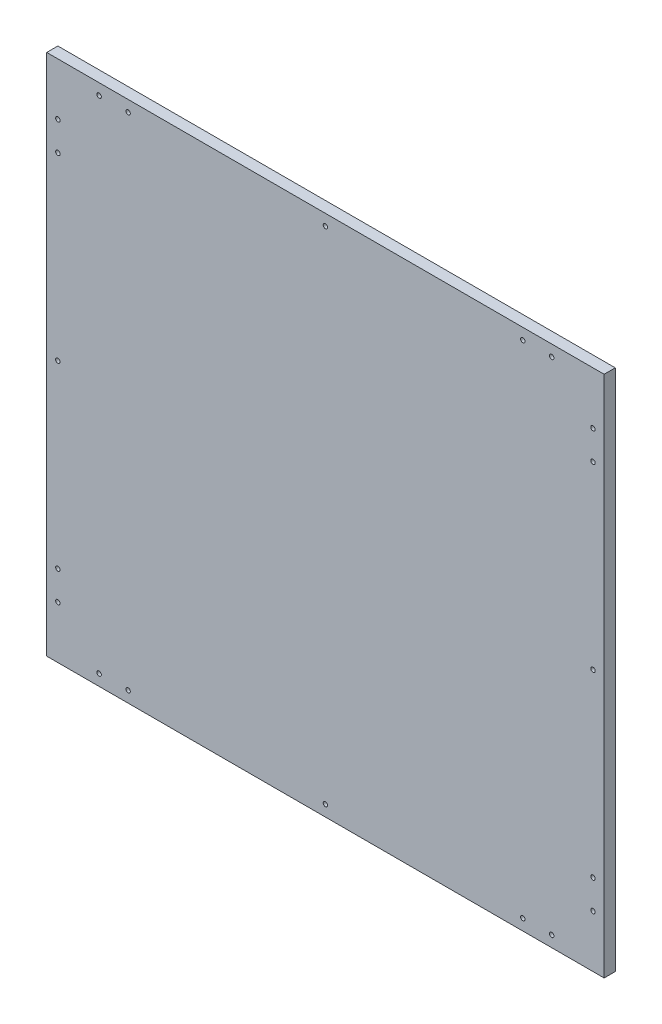
ISO-10303-21;
HEADER;
FILE_DESCRIPTION(('STEP AP214'),'2;1');
FILE_NAME('part.step','',(''),(''),'','','');
FILE_SCHEMA(('AUTOMOTIVE_DESIGN { 1 0 10303 214 1 1 1 1 }'));
ENDSEC;
DATA;
#1=APPLICATION_CONTEXT('core data for automotive mechanical design processes');
#2=APPLICATION_PROTOCOL_DEFINITION('international standard','automotive_design',2000,#1);
#3=PRODUCT_CONTEXT('',#1,'mechanical');
#4=PRODUCT('Part','Part','',(#3));
#5=PRODUCT_RELATED_PRODUCT_CATEGORY('part','',(#4));
#6=PRODUCT_DEFINITION_FORMATION('','',#4);
#7=PRODUCT_DEFINITION_CONTEXT('part definition',#1,'design');
#8=PRODUCT_DEFINITION('design','',#6,#7);
#9=PRODUCT_DEFINITION_SHAPE('','',#8);
#10=(LENGTH_UNIT() NAMED_UNIT(*) SI_UNIT(.MILLI.,.METRE.));
#11=(NAMED_UNIT(*) PLANE_ANGLE_UNIT() SI_UNIT($,.RADIAN.));
#12=(NAMED_UNIT(*) SI_UNIT($,.STERADIAN.) SOLID_ANGLE_UNIT());
#13=UNCERTAINTY_MEASURE_WITH_UNIT(LENGTH_MEASURE(1.E-05),#10,'distance_accuracy_value','');
#14=(GEOMETRIC_REPRESENTATION_CONTEXT(3) GLOBAL_UNCERTAINTY_ASSIGNED_CONTEXT((#13)) GLOBAL_UNIT_ASSIGNED_CONTEXT((#10,
#11,#12)) REPRESENTATION_CONTEXT('',''));
#15=CARTESIAN_POINT('',(0.,0.,0.));
#16=DIRECTION('',(0.,0.,1.));
#17=DIRECTION('',(1.,0.,0.));
#18=AXIS2_PLACEMENT_3D('',#15,#16,#17);
#19=CARTESIAN_POINT('',(0.,0.,10.));
#20=DIRECTION('',(0.,0.,1.));
#21=DIRECTION('',(1.,0.,0.));
#22=AXIS2_PLACEMENT_3D('',#19,#20,#21);
#23=PLANE('',#22);
#24=CARTESIAN_POINT('',(-177.,-224.5,10.));
#25=DIRECTION('',(0.,0.,-1.));
#26=DIRECTION('',(-1.,0.,0.));
#27=AXIS2_PLACEMENT_3D('',#24,#25,#26);
#28=CIRCLE('',#27,2.);
#29=CARTESIAN_POINT('',(-179.,-224.5,10.));
#30=VERTEX_POINT('',#29);
#31=EDGE_CURVE('E152',#30,#30,#28,.T.);
#32=ORIENTED_EDGE('',*,*,#31,.T.);
#33=EDGE_LOOP('',(#32));
#34=FACE_BOUND('',#33,.T.);
#35=CARTESIAN_POINT('',(0.,224.5,10.));
#36=DIRECTION('',(0.,0.,-1.));
#37=DIRECTION('',(-1.,0.,0.));
#38=AXIS2_PLACEMENT_3D('',#35,#36,#37);
#39=CIRCLE('',#38,2.);
#40=CARTESIAN_POINT('',(-1.99999999999994,224.5,10.));
#41=VERTEX_POINT('',#40);
#42=EDGE_CURVE('E98',#41,#41,#39,.T.);
#43=ORIENTED_EDGE('',*,*,#42,.T.);
#44=EDGE_LOOP('',(#43));
#45=FACE_BOUND('',#44,.T.);
#46=CARTESIAN_POINT('',(177.,224.5,10.));
#47=DIRECTION('',(0.,0.,-1.));
#48=DIRECTION('',(-1.,0.,0.));
#49=AXIS2_PLACEMENT_3D('',#46,#47,#48);
#50=CIRCLE('',#49,2.);
#51=CARTESIAN_POINT('',(175.,224.5,10.));
#52=VERTEX_POINT('',#51);
#53=EDGE_CURVE('E117',#52,#52,#50,.T.);
#54=ORIENTED_EDGE('',*,*,#53,.T.);
#55=EDGE_LOOP('',(#54));
#56=FACE_BOUND('',#55,.T.);
#57=CARTESIAN_POINT('',(203.,224.5,10.));
#58=DIRECTION('',(0.,0.,-1.));
#59=DIRECTION('',(-1.,0.,0.));
#60=AXIS2_PLACEMENT_3D('',#57,#58,#59);
#61=CIRCLE('',#60,2.);
#62=CARTESIAN_POINT('',(201.,224.5,10.));
#63=VERTEX_POINT('',#62);
#64=EDGE_CURVE('E111',#63,#63,#61,.T.);
#65=ORIENTED_EDGE('',*,*,#64,.T.);
#66=EDGE_LOOP('',(#65));
#67=FACE_BOUND('',#66,.T.);
#68=CARTESIAN_POINT('',(240.,187.5,10.));
#69=DIRECTION('',(0.,0.,-1.));
#70=DIRECTION('',(-1.,0.,0.));
#71=AXIS2_PLACEMENT_3D('',#68,#69,#70);
#72=CIRCLE('',#71,2.);
#73=CARTESIAN_POINT('',(238.,187.5,10.));
#74=VERTEX_POINT('',#73);
#75=EDGE_CURVE('E104',#74,#74,#72,.T.);
#76=ORIENTED_EDGE('',*,*,#75,.T.);
#77=EDGE_LOOP('',(#76));
#78=FACE_BOUND('',#77,.T.);
#79=CARTESIAN_POINT('',(240.,161.5,10.));
#80=DIRECTION('',(0.,0.,-1.));
#81=DIRECTION('',(-1.,0.,0.));
#82=AXIS2_PLACEMENT_3D('',#79,#80,#81);
#83=CIRCLE('',#82,2.);
#84=CARTESIAN_POINT('',(238.,161.5,10.));
#85=VERTEX_POINT('',#84);
#86=EDGE_CURVE('E105',#85,#85,#83,.T.);
#87=ORIENTED_EDGE('',*,*,#86,.T.);
#88=EDGE_LOOP('',(#87));
#89=FACE_BOUND('',#88,.T.);
#90=CARTESIAN_POINT('',(-203.,-224.5,10.));
#91=DIRECTION('',(0.,0.,-1.));
#92=DIRECTION('',(-1.,0.,0.));
#93=AXIS2_PLACEMENT_3D('',#90,#91,#92);
#94=CIRCLE('',#93,2.);
#95=CARTESIAN_POINT('',(-205.,-224.5,10.));
#96=VERTEX_POINT('',#95);
#97=EDGE_CURVE('E153',#96,#96,#94,.T.);
#98=ORIENTED_EDGE('',*,*,#97,.T.);
#99=EDGE_LOOP('',(#98));
#100=FACE_BOUND('',#99,.T.);
#101=CARTESIAN_POINT('',(-240.,-187.5,10.));
#102=DIRECTION('',(0.,0.,-1.));
#103=DIRECTION('',(-1.,0.,0.));
#104=AXIS2_PLACEMENT_3D('',#101,#102,#103);
#105=CIRCLE('',#104,2.);
#106=CARTESIAN_POINT('',(-242.,-187.5,10.));
#107=VERTEX_POINT('',#106);
#108=EDGE_CURVE('E206',#107,#107,#105,.T.);
#109=ORIENTED_EDGE('',*,*,#108,.T.);
#110=EDGE_LOOP('',(#109));
#111=FACE_BOUND('',#110,.T.);
#112=CARTESIAN_POINT('',(-240.,-161.5,10.));
#113=DIRECTION('',(0.,0.,-1.));
#114=DIRECTION('',(-1.,0.,0.));
#115=AXIS2_PLACEMENT_3D('',#112,#113,#114);
#116=CIRCLE('',#115,2.);
#117=CARTESIAN_POINT('',(-242.,-161.5,10.));
#118=VERTEX_POINT('',#117);
#119=EDGE_CURVE('E200',#118,#118,#116,.T.);
#120=ORIENTED_EDGE('',*,*,#119,.T.);
#121=EDGE_LOOP('',(#120));
#122=FACE_BOUND('',#121,.T.);
#123=CARTESIAN_POINT('',(240.,1.18687539380863E-13,10.));
#124=DIRECTION('',(0.,0.,-1.));
#125=DIRECTION('',(-1.,0.,0.));
#126=AXIS2_PLACEMENT_3D('',#123,#124,#125);
#127=CIRCLE('',#126,2.);
#128=CARTESIAN_POINT('',(238.,1.18687539380863E-13,10.));
#129=VERTEX_POINT('',#128);
#130=EDGE_CURVE('E95',#129,#129,#127,.T.);
#131=ORIENTED_EDGE('',*,*,#130,.T.);
#132=EDGE_LOOP('',(#131));
#133=FACE_BOUND('',#132,.T.);
#134=DIRECTION('',(0.,1.,0.));
#135=VECTOR('',#134,1.);
#136=CARTESIAN_POINT('',(250.,234.5,10.));
#137=LINE('',#136,#135);
#138=CARTESIAN_POINT('',(250.,-234.5,10.));
#139=VERTEX_POINT('',#138);
#140=CARTESIAN_POINT('',(250.,234.5,10.));
#141=VERTEX_POINT('',#140);
#142=EDGE_CURVE('E68',#139,#141,#137,.T.);
#143=ORIENTED_EDGE('',*,*,#142,.T.);
#144=DIRECTION('',(-1.,0.,0.));
#145=VECTOR('',#144,1.);
#146=CARTESIAN_POINT('',(-250.,234.5,10.));
#147=LINE('',#146,#145);
#148=CARTESIAN_POINT('',(-250.,234.5,10.));
#149=VERTEX_POINT('',#148);
#150=EDGE_CURVE('E63',#141,#149,#147,.T.);
#151=ORIENTED_EDGE('',*,*,#150,.T.);
#152=DIRECTION('',(0.,-1.,0.));
#153=VECTOR('',#152,1.);
#154=CARTESIAN_POINT('',(-250.,234.5,10.));
#155=LINE('',#154,#153);
#156=CARTESIAN_POINT('',(-250.,-234.5,10.));
#157=VERTEX_POINT('',#156);
#158=EDGE_CURVE('E66',#149,#157,#155,.T.);
#159=ORIENTED_EDGE('',*,*,#158,.T.);
#160=DIRECTION('',(1.,0.,0.));
#161=VECTOR('',#160,1.);
#162=CARTESIAN_POINT('',(-250.,-234.5,10.));
#163=LINE('',#162,#161);
#164=EDGE_CURVE('E33',#157,#139,#163,.T.);
#165=ORIENTED_EDGE('',*,*,#164,.T.);
#166=EDGE_LOOP('',(#143,#151,#159,#165));
#167=FACE_BOUND('',#166,.T.);
#168=CARTESIAN_POINT('',(-240.,187.5,10.));
#169=DIRECTION('',(0.,0.,1.));
#170=DIRECTION('',(1.,0.,0.));
#171=AXIS2_PLACEMENT_3D('',#168,#169,#170);
#172=CIRCLE('',#171,2.);
#173=CARTESIAN_POINT('',(-238.,187.5,10.));
#174=VERTEX_POINT('',#173);
#175=EDGE_CURVE('E128',#174,#174,#172,.T.);
#176=ORIENTED_EDGE('',*,*,#175,.F.);
#177=EDGE_LOOP('',(#176));
#178=FACE_BOUND('',#177,.T.);
#179=CARTESIAN_POINT('',(-203.,224.5,10.));
#180=DIRECTION('',(0.,0.,1.));
#181=DIRECTION('',(1.,0.,0.));
#182=AXIS2_PLACEMENT_3D('',#179,#180,#181);
#183=CIRCLE('',#182,2.);
#184=CARTESIAN_POINT('',(-201.,224.5,10.));
#185=VERTEX_POINT('',#184);
#186=EDGE_CURVE('E135',#185,#185,#183,.T.);
#187=ORIENTED_EDGE('',*,*,#186,.F.);
#188=EDGE_LOOP('',(#187));
#189=FACE_BOUND('',#188,.T.);
#190=CARTESIAN_POINT('',(-177.,224.5,10.));
#191=DIRECTION('',(0.,0.,1.));
#192=DIRECTION('',(1.,0.,0.));
#193=AXIS2_PLACEMENT_3D('',#190,#191,#192);
#194=CIRCLE('',#193,2.);
#195=CARTESIAN_POINT('',(-175.,224.5,10.));
#196=VERTEX_POINT('',#195);
#197=EDGE_CURVE('E141',#196,#196,#194,.T.);
#198=ORIENTED_EDGE('',*,*,#197,.F.);
#199=EDGE_LOOP('',(#198));
#200=FACE_BOUND('',#199,.T.);
#201=CARTESIAN_POINT('',(-240.,161.5,10.));
#202=DIRECTION('',(0.,0.,1.));
#203=DIRECTION('',(1.,0.,0.));
#204=AXIS2_PLACEMENT_3D('',#201,#202,#203);
#205=CIRCLE('',#204,2.);
#206=CARTESIAN_POINT('',(-238.,161.5,10.));
#207=VERTEX_POINT('',#206);
#208=EDGE_CURVE('E129',#207,#207,#205,.T.);
#209=ORIENTED_EDGE('',*,*,#208,.F.);
#210=EDGE_LOOP('',(#209));
#211=FACE_BOUND('',#210,.T.);
#212=CARTESIAN_POINT('',(-240.,0.,10.));
#213=DIRECTION('',(0.,0.,1.));
#214=DIRECTION('',(1.,0.,0.));
#215=AXIS2_PLACEMENT_3D('',#212,#213,#214);
#216=CIRCLE('',#215,2.);
#217=CARTESIAN_POINT('',(-238.,0.,10.));
#218=VERTEX_POINT('',#217);
#219=EDGE_CURVE('E189',#218,#218,#216,.T.);
#220=ORIENTED_EDGE('',*,*,#219,.F.);
#221=EDGE_LOOP('',(#220));
#222=FACE_BOUND('',#221,.T.);
#223=CARTESIAN_POINT('',(240.,-161.5,10.));
#224=DIRECTION('',(0.,0.,1.));
#225=DIRECTION('',(1.,0.,0.));
#226=AXIS2_PLACEMENT_3D('',#223,#224,#225);
#227=CIRCLE('',#226,2.);
#228=CARTESIAN_POINT('',(242.,-161.5,10.));
#229=VERTEX_POINT('',#228);
#230=EDGE_CURVE('E183',#229,#229,#227,.T.);
#231=ORIENTED_EDGE('',*,*,#230,.F.);
#232=EDGE_LOOP('',(#231));
#233=FACE_BOUND('',#232,.T.);
#234=CARTESIAN_POINT('',(240.,-187.5,10.));
#235=DIRECTION('',(0.,0.,1.));
#236=DIRECTION('',(1.,0.,0.));
#237=AXIS2_PLACEMENT_3D('',#234,#235,#236);
#238=CIRCLE('',#237,2.);
#239=CARTESIAN_POINT('',(242.,-187.5,10.));
#240=VERTEX_POINT('',#239);
#241=EDGE_CURVE('E177',#240,#240,#238,.T.);
#242=ORIENTED_EDGE('',*,*,#241,.F.);
#243=EDGE_LOOP('',(#242));
#244=FACE_BOUND('',#243,.T.);
#245=CARTESIAN_POINT('',(203.,-224.5,10.));
#246=DIRECTION('',(0.,0.,1.));
#247=DIRECTION('',(1.,0.,0.));
#248=AXIS2_PLACEMENT_3D('',#245,#246,#247);
#249=CIRCLE('',#248,2.);
#250=CARTESIAN_POINT('',(205.,-224.5,10.));
#251=VERTEX_POINT('',#250);
#252=EDGE_CURVE('E171',#251,#251,#249,.T.);
#253=ORIENTED_EDGE('',*,*,#252,.F.);
#254=EDGE_LOOP('',(#253));
#255=FACE_BOUND('',#254,.T.);
#256=CARTESIAN_POINT('',(177.,-224.5,10.));
#257=DIRECTION('',(0.,0.,1.));
#258=DIRECTION('',(1.,0.,0.));
#259=AXIS2_PLACEMENT_3D('',#256,#257,#258);
#260=CIRCLE('',#259,2.);
#261=CARTESIAN_POINT('',(179.,-224.5,10.));
#262=VERTEX_POINT('',#261);
#263=EDGE_CURVE('E165',#262,#262,#260,.T.);
#264=ORIENTED_EDGE('',*,*,#263,.F.);
#265=EDGE_LOOP('',(#264));
#266=FACE_BOUND('',#265,.T.);
#267=CARTESIAN_POINT('',(0.,-224.5,10.));
#268=DIRECTION('',(0.,0.,1.));
#269=DIRECTION('',(1.,0.,0.));
#270=AXIS2_PLACEMENT_3D('',#267,#268,#269);
#271=CIRCLE('',#270,2.);
#272=CARTESIAN_POINT('',(2.00000000000006,-224.5,10.));
#273=VERTEX_POINT('',#272);
#274=EDGE_CURVE('E159',#273,#273,#271,.T.);
#275=ORIENTED_EDGE('',*,*,#274,.F.);
#276=EDGE_LOOP('',(#275));
#277=FACE_BOUND('',#276,.T.);
#278=ADVANCED_FACE('F16',(#34,#45,#56,#67,#78,#89,#100,#111,#122,#133,#167,#178,#189,#200,#211,
#222,#233,#244,#255,#266,#277),#23,.T.);
#279=CARTESIAN_POINT('',(0.,0.,0.));
#280=DIRECTION('',(0.,0.,1.));
#281=DIRECTION('',(1.,0.,0.));
#282=AXIS2_PLACEMENT_3D('',#279,#280,#281);
#283=PLANE('',#282);
#284=CARTESIAN_POINT('',(-177.,-224.5,0.));
#285=DIRECTION('',(0.,0.,-1.));
#286=DIRECTION('',(-1.,0.,0.));
#287=AXIS2_PLACEMENT_3D('',#284,#285,#286);
#288=CIRCLE('',#287,2.);
#289=CARTESIAN_POINT('',(-179.,-224.5,0.));
#290=VERTEX_POINT('',#289);
#291=EDGE_CURVE('E149',#290,#290,#288,.T.);
#292=ORIENTED_EDGE('',*,*,#291,.F.);
#293=EDGE_LOOP('',(#292));
#294=FACE_BOUND('',#293,.T.);
#295=CARTESIAN_POINT('',(177.,-224.5,0.));
#296=DIRECTION('',(0.,0.,1.));
#297=DIRECTION('',(1.,0.,0.));
#298=AXIS2_PLACEMENT_3D('',#295,#296,#297);
#299=CIRCLE('',#298,2.);
#300=CARTESIAN_POINT('',(179.,-224.5,0.));
#301=VERTEX_POINT('',#300);
#302=EDGE_CURVE('E162',#301,#301,#299,.T.);
#303=ORIENTED_EDGE('',*,*,#302,.T.);
#304=EDGE_LOOP('',(#303));
#305=FACE_BOUND('',#304,.T.);
#306=CARTESIAN_POINT('',(240.,-187.5,0.));
#307=DIRECTION('',(0.,0.,1.));
#308=DIRECTION('',(1.,0.,0.));
#309=AXIS2_PLACEMENT_3D('',#306,#307,#308);
#310=CIRCLE('',#309,2.);
#311=CARTESIAN_POINT('',(242.,-187.5,0.));
#312=VERTEX_POINT('',#311);
#313=EDGE_CURVE('E174',#312,#312,#310,.T.);
#314=ORIENTED_EDGE('',*,*,#313,.T.);
#315=EDGE_LOOP('',(#314));
#316=FACE_BOUND('',#315,.T.);
#317=CARTESIAN_POINT('',(-240.,0.,0.));
#318=DIRECTION('',(0.,0.,1.));
#319=DIRECTION('',(1.,0.,0.));
#320=AXIS2_PLACEMENT_3D('',#317,#318,#319);
#321=CIRCLE('',#320,2.);
#322=CARTESIAN_POINT('',(-238.,0.,0.));
#323=VERTEX_POINT('',#322);
#324=EDGE_CURVE('E186',#323,#323,#321,.T.);
#325=ORIENTED_EDGE('',*,*,#324,.T.);
#326=EDGE_LOOP('',(#325));
#327=FACE_BOUND('',#326,.T.);
#328=CARTESIAN_POINT('',(-177.,224.5,0.));
#329=DIRECTION('',(0.,0.,1.));
#330=DIRECTION('',(1.,0.,0.));
#331=AXIS2_PLACEMENT_3D('',#328,#329,#330);
#332=CIRCLE('',#331,2.);
#333=CARTESIAN_POINT('',(-175.,224.5,0.));
#334=VERTEX_POINT('',#333);
#335=EDGE_CURVE('E138',#334,#334,#332,.T.);
#336=ORIENTED_EDGE('',*,*,#335,.T.);
#337=EDGE_LOOP('',(#336));
#338=FACE_BOUND('',#337,.T.);
#339=CARTESIAN_POINT('',(-240.,187.5,0.));
#340=DIRECTION('',(0.,0.,1.));
#341=DIRECTION('',(1.,0.,0.));
#342=AXIS2_PLACEMENT_3D('',#339,#340,#341);
#343=CIRCLE('',#342,2.);
#344=CARTESIAN_POINT('',(-238.,187.5,0.));
#345=VERTEX_POINT('',#344);
#346=EDGE_CURVE('E125',#345,#345,#343,.T.);
#347=ORIENTED_EDGE('',*,*,#346,.T.);
#348=EDGE_LOOP('',(#347));
#349=FACE_BOUND('',#348,.T.);
#350=CARTESIAN_POINT('',(-203.,-224.5,0.));
#351=DIRECTION('',(0.,0.,-1.));
#352=DIRECTION('',(-1.,0.,0.));
#353=AXIS2_PLACEMENT_3D('',#350,#351,#352);
#354=CIRCLE('',#353,2.);
#355=CARTESIAN_POINT('',(-205.,-224.5,0.));
#356=VERTEX_POINT('',#355);
#357=EDGE_CURVE('E209',#356,#356,#354,.T.);
#358=ORIENTED_EDGE('',*,*,#357,.F.);
#359=EDGE_LOOP('',(#358));
#360=FACE_BOUND('',#359,.T.);
#361=CARTESIAN_POINT('',(-240.,-187.5,0.));
#362=DIRECTION('',(0.,0.,-1.));
#363=DIRECTION('',(-1.,0.,0.));
#364=AXIS2_PLACEMENT_3D('',#361,#362,#363);
#365=CIRCLE('',#364,2.);
#366=CARTESIAN_POINT('',(-242.,-187.5,0.));
#367=VERTEX_POINT('',#366);
#368=EDGE_CURVE('E203',#367,#367,#365,.T.);
#369=ORIENTED_EDGE('',*,*,#368,.F.);
#370=EDGE_LOOP('',(#369));
#371=FACE_BOUND('',#370,.T.);
#372=CARTESIAN_POINT('',(-240.,-161.5,0.));
#373=DIRECTION('',(0.,0.,-1.));
#374=DIRECTION('',(-1.,0.,0.));
#375=AXIS2_PLACEMENT_3D('',#372,#373,#374);
#376=CIRCLE('',#375,2.);
#377=CARTESIAN_POINT('',(-242.,-161.5,0.));
#378=VERTEX_POINT('',#377);
#379=EDGE_CURVE('E197',#378,#378,#376,.T.);
#380=ORIENTED_EDGE('',*,*,#379,.F.);
#381=EDGE_LOOP('',(#380));
#382=FACE_BOUND('',#381,.T.);
#383=CARTESIAN_POINT('',(240.,1.18687539380863E-13,0.));
#384=DIRECTION('',(0.,0.,-1.));
#385=DIRECTION('',(-1.,0.,0.));
#386=AXIS2_PLACEMENT_3D('',#383,#384,#385);
#387=CIRCLE('',#386,2.);
#388=CARTESIAN_POINT('',(238.,1.18687539380863E-13,0.));
#389=VERTEX_POINT('',#388);
#390=EDGE_CURVE('E83',#389,#389,#387,.T.);
#391=ORIENTED_EDGE('',*,*,#390,.F.);
#392=EDGE_LOOP('',(#391));
#393=FACE_BOUND('',#392,.T.);
#394=DIRECTION('',(0.,1.,0.));
#395=VECTOR('',#394,1.);
#396=CARTESIAN_POINT('',(250.,234.5,0.));
#397=LINE('',#396,#395);
#398=CARTESIAN_POINT('',(250.,-234.5,0.));
#399=VERTEX_POINT('',#398);
#400=CARTESIAN_POINT('',(250.,234.5,0.));
#401=VERTEX_POINT('',#400);
#402=EDGE_CURVE('E80',#399,#401,#397,.T.);
#403=ORIENTED_EDGE('',*,*,#402,.F.);
#404=DIRECTION('',(1.,0.,0.));
#405=VECTOR('',#404,1.);
#406=CARTESIAN_POINT('',(-250.,-234.5,0.));
#407=LINE('',#406,#405);
#408=CARTESIAN_POINT('',(-250.,-234.5,0.));
#409=VERTEX_POINT('',#408);
#410=EDGE_CURVE('E56',#409,#399,#407,.T.);
#411=ORIENTED_EDGE('',*,*,#410,.F.);
#412=DIRECTION('',(0.,-1.,0.));
#413=VECTOR('',#412,1.);
#414=CARTESIAN_POINT('',(-250.,234.5,0.));
#415=LINE('',#414,#413);
#416=CARTESIAN_POINT('',(-250.,234.5,0.));
#417=VERTEX_POINT('',#416);
#418=EDGE_CURVE('E50',#417,#409,#415,.T.);
#419=ORIENTED_EDGE('',*,*,#418,.F.);
#420=DIRECTION('',(-1.,0.,0.));
#421=VECTOR('',#420,1.);
#422=CARTESIAN_POINT('',(-250.,234.5,0.));
#423=LINE('',#422,#421);
#424=EDGE_CURVE('E72',#401,#417,#423,.T.);
#425=ORIENTED_EDGE('',*,*,#424,.F.);
#426=EDGE_LOOP('',(#403,#411,#419,#425));
#427=FACE_BOUND('',#426,.T.);
#428=CARTESIAN_POINT('',(-203.,224.5,0.));
#429=DIRECTION('',(0.,0.,1.));
#430=DIRECTION('',(1.,0.,0.));
#431=AXIS2_PLACEMENT_3D('',#428,#429,#430);
#432=CIRCLE('',#431,2.);
#433=CARTESIAN_POINT('',(-201.,224.5,0.));
#434=VERTEX_POINT('',#433);
#435=EDGE_CURVE('E132',#434,#434,#432,.T.);
#436=ORIENTED_EDGE('',*,*,#435,.T.);
#437=EDGE_LOOP('',(#436));
#438=FACE_BOUND('',#437,.T.);
#439=CARTESIAN_POINT('',(240.,161.5,0.));
#440=DIRECTION('',(0.,0.,-1.));
#441=DIRECTION('',(-1.,0.,0.));
#442=AXIS2_PLACEMENT_3D('',#439,#440,#441);
#443=CIRCLE('',#442,2.);
#444=CARTESIAN_POINT('',(238.,161.5,0.));
#445=VERTEX_POINT('',#444);
#446=EDGE_CURVE('E144',#445,#445,#443,.T.);
#447=ORIENTED_EDGE('',*,*,#446,.F.);
#448=EDGE_LOOP('',(#447));
#449=FACE_BOUND('',#448,.T.);
#450=CARTESIAN_POINT('',(240.,187.5,0.));
#451=DIRECTION('',(0.,0.,-1.));
#452=DIRECTION('',(-1.,0.,0.));
#453=AXIS2_PLACEMENT_3D('',#450,#451,#452);
#454=CIRCLE('',#453,2.);
#455=CARTESIAN_POINT('',(238.,187.5,0.));
#456=VERTEX_POINT('',#455);
#457=EDGE_CURVE('E101',#456,#456,#454,.T.);
#458=ORIENTED_EDGE('',*,*,#457,.F.);
#459=EDGE_LOOP('',(#458));
#460=FACE_BOUND('',#459,.T.);
#461=CARTESIAN_POINT('',(203.,224.5,0.));
#462=DIRECTION('',(0.,0.,-1.));
#463=DIRECTION('',(-1.,0.,0.));
#464=AXIS2_PLACEMENT_3D('',#461,#462,#463);
#465=CIRCLE('',#464,2.);
#466=CARTESIAN_POINT('',(201.,224.5,0.));
#467=VERTEX_POINT('',#466);
#468=EDGE_CURVE('E108',#467,#467,#465,.T.);
#469=ORIENTED_EDGE('',*,*,#468,.F.);
#470=EDGE_LOOP('',(#469));
#471=FACE_BOUND('',#470,.T.);
#472=CARTESIAN_POINT('',(177.,224.5,0.));
#473=DIRECTION('',(0.,0.,-1.));
#474=DIRECTION('',(-1.,0.,0.));
#475=AXIS2_PLACEMENT_3D('',#472,#473,#474);
#476=CIRCLE('',#475,2.);
#477=CARTESIAN_POINT('',(175.,224.5,0.));
#478=VERTEX_POINT('',#477);
#479=EDGE_CURVE('E114',#478,#478,#476,.T.);
#480=ORIENTED_EDGE('',*,*,#479,.F.);
#481=EDGE_LOOP('',(#480));
#482=FACE_BOUND('',#481,.T.);
#483=CARTESIAN_POINT('',(0.,224.5,0.));
#484=DIRECTION('',(0.,0.,-1.));
#485=DIRECTION('',(-1.,0.,0.));
#486=AXIS2_PLACEMENT_3D('',#483,#484,#485);
#487=CIRCLE('',#486,2.);
#488=CARTESIAN_POINT('',(-1.99999999999994,224.5,0.));
#489=VERTEX_POINT('',#488);
#490=EDGE_CURVE('E120',#489,#489,#487,.T.);
#491=ORIENTED_EDGE('',*,*,#490,.F.);
#492=EDGE_LOOP('',(#491));
#493=FACE_BOUND('',#492,.T.);
#494=CARTESIAN_POINT('',(-240.,161.5,0.));
#495=DIRECTION('',(0.,0.,1.));
#496=DIRECTION('',(1.,0.,0.));
#497=AXIS2_PLACEMENT_3D('',#494,#495,#496);
#498=CIRCLE('',#497,2.);
#499=CARTESIAN_POINT('',(-238.,161.5,0.));
#500=VERTEX_POINT('',#499);
#501=EDGE_CURVE('E192',#500,#500,#498,.T.);
#502=ORIENTED_EDGE('',*,*,#501,.T.);
#503=EDGE_LOOP('',(#502));
#504=FACE_BOUND('',#503,.T.);
#505=CARTESIAN_POINT('',(240.,-161.5,0.));
#506=DIRECTION('',(0.,0.,1.));
#507=DIRECTION('',(1.,0.,0.));
#508=AXIS2_PLACEMENT_3D('',#505,#506,#507);
#509=CIRCLE('',#508,2.);
#510=CARTESIAN_POINT('',(242.,-161.5,0.));
#511=VERTEX_POINT('',#510);
#512=EDGE_CURVE('E180',#511,#511,#509,.T.);
#513=ORIENTED_EDGE('',*,*,#512,.T.);
#514=EDGE_LOOP('',(#513));
#515=FACE_BOUND('',#514,.T.);
#516=CARTESIAN_POINT('',(203.,-224.5,0.));
#517=DIRECTION('',(0.,0.,1.));
#518=DIRECTION('',(1.,0.,0.));
#519=AXIS2_PLACEMENT_3D('',#516,#517,#518);
#520=CIRCLE('',#519,2.);
#521=CARTESIAN_POINT('',(205.,-224.5,0.));
#522=VERTEX_POINT('',#521);
#523=EDGE_CURVE('E168',#522,#522,#520,.T.);
#524=ORIENTED_EDGE('',*,*,#523,.T.);
#525=EDGE_LOOP('',(#524));
#526=FACE_BOUND('',#525,.T.);
#527=CARTESIAN_POINT('',(0.,-224.5,0.));
#528=DIRECTION('',(0.,0.,1.));
#529=DIRECTION('',(1.,0.,0.));
#530=AXIS2_PLACEMENT_3D('',#527,#528,#529);
#531=CIRCLE('',#530,2.);
#532=CARTESIAN_POINT('',(2.00000000000006,-224.5,0.));
#533=VERTEX_POINT('',#532);
#534=EDGE_CURVE('E156',#533,#533,#531,.T.);
#535=ORIENTED_EDGE('',*,*,#534,.T.);
#536=EDGE_LOOP('',(#535));
#537=FACE_BOUND('',#536,.T.);
#538=ADVANCED_FACE('F91',(#294,#305,#316,#327,#338,#349,#360,#371,#382,#393,#427,#438,#449,#460,
#471,#482,#493,#504,#515,#526,#537),#283,.F.);
#539=CARTESIAN_POINT('',(250.,234.5,10.));
#540=DIRECTION('',(-1.,0.,0.));
#541=DIRECTION('',(0.,-1.,0.));
#542=AXIS2_PLACEMENT_3D('',#539,#540,#541);
#543=PLANE('',#542);
#544=ORIENTED_EDGE('',*,*,#402,.T.);
#545=DIRECTION('',(0.,0.,-1.));
#546=VECTOR('',#545,1.);
#547=CARTESIAN_POINT('',(250.,234.5,10.));
#548=LINE('',#547,#546);
#549=EDGE_CURVE('E10',#141,#401,#548,.T.);
#550=ORIENTED_EDGE('',*,*,#549,.F.);
#551=ORIENTED_EDGE('',*,*,#142,.F.);
#552=DIRECTION('',(0.,0.,-1.));
#553=VECTOR('',#552,1.);
#554=CARTESIAN_POINT('',(250.,-234.5,10.));
#555=LINE('',#554,#553);
#556=EDGE_CURVE('E76',#139,#399,#555,.T.);
#557=ORIENTED_EDGE('',*,*,#556,.T.);
#558=EDGE_LOOP('',(#544,#550,#551,#557));
#559=FACE_BOUND('',#558,.T.);
#560=ADVANCED_FACE('F18',(#559),#543,.F.);
#561=CARTESIAN_POINT('',(-250.,234.5,10.));
#562=DIRECTION('',(0.,-1.,0.));
#563=DIRECTION('',(0.,0.,-1.));
#564=AXIS2_PLACEMENT_3D('',#561,#562,#563);
#565=PLANE('',#564);
#566=ORIENTED_EDGE('',*,*,#424,.T.);
#567=DIRECTION('',(0.,0.,-1.));
#568=VECTOR('',#567,1.);
#569=CARTESIAN_POINT('',(-250.,234.5,10.));
#570=LINE('',#569,#568);
#571=EDGE_CURVE('E25',#149,#417,#570,.T.);
#572=ORIENTED_EDGE('',*,*,#571,.F.);
#573=ORIENTED_EDGE('',*,*,#150,.F.);
#574=ORIENTED_EDGE('',*,*,#549,.T.);
#575=EDGE_LOOP('',(#566,#572,#573,#574));
#576=FACE_BOUND('',#575,.T.);
#577=ADVANCED_FACE('F71',(#576),#565,.F.);
#578=CARTESIAN_POINT('',(-250.,234.5,10.));
#579=DIRECTION('',(1.,0.,0.));
#580=DIRECTION('',(0.,1.,0.));
#581=AXIS2_PLACEMENT_3D('',#578,#579,#580);
#582=PLANE('',#581);
#583=ORIENTED_EDGE('',*,*,#418,.T.);
#584=DIRECTION('',(0.,0.,-1.));
#585=VECTOR('',#584,1.);
#586=CARTESIAN_POINT('',(-250.,-234.5,10.));
#587=LINE('',#586,#585);
#588=EDGE_CURVE('E73',#157,#409,#587,.T.);
#589=ORIENTED_EDGE('',*,*,#588,.F.);
#590=ORIENTED_EDGE('',*,*,#158,.F.);
#591=ORIENTED_EDGE('',*,*,#571,.T.);
#592=EDGE_LOOP('',(#583,#589,#590,#591));
#593=FACE_BOUND('',#592,.T.);
#594=ADVANCED_FACE('F74',(#593),#582,.F.);
#595=CARTESIAN_POINT('',(-250.,-234.5,10.));
#596=DIRECTION('',(0.,1.,0.));
#597=DIRECTION('',(0.,0.,1.));
#598=AXIS2_PLACEMENT_3D('',#595,#596,#597);
#599=PLANE('',#598);
#600=ORIENTED_EDGE('',*,*,#410,.T.);
#601=ORIENTED_EDGE('',*,*,#556,.F.);
#602=ORIENTED_EDGE('',*,*,#164,.F.);
#603=ORIENTED_EDGE('',*,*,#588,.T.);
#604=EDGE_LOOP('',(#600,#601,#602,#603));
#605=FACE_BOUND('',#604,.T.);
#606=ADVANCED_FACE('F88',(#605),#599,.F.);
#607=CARTESIAN_POINT('',(240.,1.18687539380863E-13,0.));
#608=DIRECTION('',(0.,0.,1.));
#609=DIRECTION('',(1.,0.,0.));
#610=AXIS2_PLACEMENT_3D('',#607,#608,#609);
#611=CYLINDRICAL_SURFACE('',#610,2.);
#612=ORIENTED_EDGE('',*,*,#390,.T.);
#613=EDGE_LOOP('',(#612));
#614=FACE_BOUND('',#613,.T.);
#615=ORIENTED_EDGE('',*,*,#130,.F.);
#616=EDGE_LOOP('',(#615));
#617=FACE_BOUND('',#616,.T.);
#618=ADVANCED_FACE('F246',(#614,#617),#611,.F.);
#619=CARTESIAN_POINT('',(-240.,-161.5,0.));
#620=DIRECTION('',(0.,0.,1.));
#621=DIRECTION('',(1.,0.,0.));
#622=AXIS2_PLACEMENT_3D('',#619,#620,#621);
#623=CYLINDRICAL_SURFACE('',#622,2.);
#624=ORIENTED_EDGE('',*,*,#379,.T.);
#625=EDGE_LOOP('',(#624));
#626=FACE_BOUND('',#625,.T.);
#627=ORIENTED_EDGE('',*,*,#119,.F.);
#628=EDGE_LOOP('',(#627));
#629=FACE_BOUND('',#628,.T.);
#630=ADVANCED_FACE('F232',(#626,#629),#623,.F.);
#631=CARTESIAN_POINT('',(-240.,-187.5,0.));
#632=DIRECTION('',(0.,0.,1.));
#633=DIRECTION('',(1.,0.,0.));
#634=AXIS2_PLACEMENT_3D('',#631,#632,#633);
#635=CYLINDRICAL_SURFACE('',#634,2.);
#636=ORIENTED_EDGE('',*,*,#368,.T.);
#637=EDGE_LOOP('',(#636));
#638=FACE_BOUND('',#637,.T.);
#639=ORIENTED_EDGE('',*,*,#108,.F.);
#640=EDGE_LOOP('',(#639));
#641=FACE_BOUND('',#640,.T.);
#642=ADVANCED_FACE('F220',(#638,#641),#635,.F.);
#643=CARTESIAN_POINT('',(-203.,-224.5,0.));
#644=DIRECTION('',(0.,0.,1.));
#645=DIRECTION('',(1.,0.,0.));
#646=AXIS2_PLACEMENT_3D('',#643,#644,#645);
#647=CYLINDRICAL_SURFACE('',#646,2.);
#648=ORIENTED_EDGE('',*,*,#357,.T.);
#649=EDGE_LOOP('',(#648));
#650=FACE_BOUND('',#649,.T.);
#651=ORIENTED_EDGE('',*,*,#97,.F.);
#652=EDGE_LOOP('',(#651));
#653=FACE_BOUND('',#652,.T.);
#654=ADVANCED_FACE('F217',(#650,#653),#647,.F.);
#655=CARTESIAN_POINT('',(-240.,187.5,0.));
#656=DIRECTION('',(0.,0.,1.));
#657=DIRECTION('',(1.,0.,0.));
#658=AXIS2_PLACEMENT_3D('',#655,#656,#657);
#659=CYLINDRICAL_SURFACE('',#658,2.);
#660=ORIENTED_EDGE('',*,*,#346,.F.);
#661=EDGE_LOOP('',(#660));
#662=FACE_BOUND('',#661,.T.);
#663=ORIENTED_EDGE('',*,*,#175,.T.);
#664=EDGE_LOOP('',(#663));
#665=FACE_BOUND('',#664,.T.);
#666=ADVANCED_FACE('F219',(#662,#665),#659,.F.);
#667=CARTESIAN_POINT('',(-203.,224.5,0.));
#668=DIRECTION('',(0.,0.,1.));
#669=DIRECTION('',(1.,0.,0.));
#670=AXIS2_PLACEMENT_3D('',#667,#668,#669);
#671=CYLINDRICAL_SURFACE('',#670,2.);
#672=ORIENTED_EDGE('',*,*,#435,.F.);
#673=EDGE_LOOP('',(#672));
#674=FACE_BOUND('',#673,.T.);
#675=ORIENTED_EDGE('',*,*,#186,.T.);
#676=EDGE_LOOP('',(#675));
#677=FACE_BOUND('',#676,.T.);
#678=ADVANCED_FACE('F229',(#674,#677),#671,.F.);
#679=CARTESIAN_POINT('',(-177.,224.5,0.));
#680=DIRECTION('',(0.,0.,1.));
#681=DIRECTION('',(1.,0.,0.));
#682=AXIS2_PLACEMENT_3D('',#679,#680,#681);
#683=CYLINDRICAL_SURFACE('',#682,2.);
#684=ORIENTED_EDGE('',*,*,#335,.F.);
#685=EDGE_LOOP('',(#684));
#686=FACE_BOUND('',#685,.T.);
#687=ORIENTED_EDGE('',*,*,#197,.T.);
#688=EDGE_LOOP('',(#687));
#689=FACE_BOUND('',#688,.T.);
#690=ADVANCED_FACE('F298',(#686,#689),#683,.F.);
#691=CARTESIAN_POINT('',(240.,161.5,0.));
#692=DIRECTION('',(0.,0.,1.));
#693=DIRECTION('',(1.,0.,0.));
#694=AXIS2_PLACEMENT_3D('',#691,#692,#693);
#695=CYLINDRICAL_SURFACE('',#694,2.);
#696=ORIENTED_EDGE('',*,*,#446,.T.);
#697=EDGE_LOOP('',(#696));
#698=FACE_BOUND('',#697,.T.);
#699=ORIENTED_EDGE('',*,*,#86,.F.);
#700=EDGE_LOOP('',(#699));
#701=FACE_BOUND('',#700,.T.);
#702=ADVANCED_FACE('F309',(#698,#701),#695,.F.);
#703=CARTESIAN_POINT('',(240.,187.5,0.));
#704=DIRECTION('',(0.,0.,1.));
#705=DIRECTION('',(1.,0.,0.));
#706=AXIS2_PLACEMENT_3D('',#703,#704,#705);
#707=CYLINDRICAL_SURFACE('',#706,2.);
#708=ORIENTED_EDGE('',*,*,#457,.T.);
#709=EDGE_LOOP('',(#708));
#710=FACE_BOUND('',#709,.T.);
#711=ORIENTED_EDGE('',*,*,#75,.F.);
#712=EDGE_LOOP('',(#711));
#713=FACE_BOUND('',#712,.T.);
#714=ADVANCED_FACE('F319',(#710,#713),#707,.F.);
#715=CARTESIAN_POINT('',(203.,224.5,0.));
#716=DIRECTION('',(0.,0.,1.));
#717=DIRECTION('',(1.,0.,0.));
#718=AXIS2_PLACEMENT_3D('',#715,#716,#717);
#719=CYLINDRICAL_SURFACE('',#718,2.);
#720=ORIENTED_EDGE('',*,*,#468,.T.);
#721=EDGE_LOOP('',(#720));
#722=FACE_BOUND('',#721,.T.);
#723=ORIENTED_EDGE('',*,*,#64,.F.);
#724=EDGE_LOOP('',(#723));
#725=FACE_BOUND('',#724,.T.);
#726=ADVANCED_FACE('F329',(#722,#725),#719,.F.);
#727=CARTESIAN_POINT('',(177.,224.5,0.));
#728=DIRECTION('',(0.,0.,1.));
#729=DIRECTION('',(1.,0.,0.));
#730=AXIS2_PLACEMENT_3D('',#727,#728,#729);
#731=CYLINDRICAL_SURFACE('',#730,2.);
#732=ORIENTED_EDGE('',*,*,#479,.T.);
#733=EDGE_LOOP('',(#732));
#734=FACE_BOUND('',#733,.T.);
#735=ORIENTED_EDGE('',*,*,#53,.F.);
#736=EDGE_LOOP('',(#735));
#737=FACE_BOUND('',#736,.T.);
#738=ADVANCED_FACE('F338',(#734,#737),#731,.F.);
#739=CARTESIAN_POINT('',(0.,224.5,0.));
#740=DIRECTION('',(0.,0.,1.));
#741=DIRECTION('',(1.,0.,0.));
#742=AXIS2_PLACEMENT_3D('',#739,#740,#741);
#743=CYLINDRICAL_SURFACE('',#742,2.);
#744=ORIENTED_EDGE('',*,*,#490,.T.);
#745=EDGE_LOOP('',(#744));
#746=FACE_BOUND('',#745,.T.);
#747=ORIENTED_EDGE('',*,*,#42,.F.);
#748=EDGE_LOOP('',(#747));
#749=FACE_BOUND('',#748,.T.);
#750=ADVANCED_FACE('F348',(#746,#749),#743,.F.);
#751=CARTESIAN_POINT('',(-240.,161.5,0.));
#752=DIRECTION('',(0.,0.,1.));
#753=DIRECTION('',(1.,0.,0.));
#754=AXIS2_PLACEMENT_3D('',#751,#752,#753);
#755=CYLINDRICAL_SURFACE('',#754,2.);
#756=ORIENTED_EDGE('',*,*,#501,.F.);
#757=EDGE_LOOP('',(#756));
#758=FACE_BOUND('',#757,.T.);
#759=ORIENTED_EDGE('',*,*,#208,.T.);
#760=EDGE_LOOP('',(#759));
#761=FACE_BOUND('',#760,.T.);
#762=ADVANCED_FACE('F358',(#758,#761),#755,.F.);
#763=CARTESIAN_POINT('',(-240.,0.,0.));
#764=DIRECTION('',(0.,0.,1.));
#765=DIRECTION('',(1.,0.,0.));
#766=AXIS2_PLACEMENT_3D('',#763,#764,#765);
#767=CYLINDRICAL_SURFACE('',#766,2.);
#768=ORIENTED_EDGE('',*,*,#324,.F.);
#769=EDGE_LOOP('',(#768));
#770=FACE_BOUND('',#769,.T.);
#771=ORIENTED_EDGE('',*,*,#219,.T.);
#772=EDGE_LOOP('',(#771));
#773=FACE_BOUND('',#772,.T.);
#774=ADVANCED_FACE('F368',(#770,#773),#767,.F.);
#775=CARTESIAN_POINT('',(240.,-161.5,0.));
#776=DIRECTION('',(0.,0.,1.));
#777=DIRECTION('',(1.,0.,0.));
#778=AXIS2_PLACEMENT_3D('',#775,#776,#777);
#779=CYLINDRICAL_SURFACE('',#778,2.);
#780=ORIENTED_EDGE('',*,*,#512,.F.);
#781=EDGE_LOOP('',(#780));
#782=FACE_BOUND('',#781,.T.);
#783=ORIENTED_EDGE('',*,*,#230,.T.);
#784=EDGE_LOOP('',(#783));
#785=FACE_BOUND('',#784,.T.);
#786=ADVANCED_FACE('F378',(#782,#785),#779,.F.);
#787=CARTESIAN_POINT('',(240.,-187.5,0.));
#788=DIRECTION('',(0.,0.,1.));
#789=DIRECTION('',(1.,0.,0.));
#790=AXIS2_PLACEMENT_3D('',#787,#788,#789);
#791=CYLINDRICAL_SURFACE('',#790,2.);
#792=ORIENTED_EDGE('',*,*,#313,.F.);
#793=EDGE_LOOP('',(#792));
#794=FACE_BOUND('',#793,.T.);
#795=ORIENTED_EDGE('',*,*,#241,.T.);
#796=EDGE_LOOP('',(#795));
#797=FACE_BOUND('',#796,.T.);
#798=ADVANCED_FACE('F388',(#794,#797),#791,.F.);
#799=CARTESIAN_POINT('',(203.,-224.5,0.));
#800=DIRECTION('',(0.,0.,1.));
#801=DIRECTION('',(1.,0.,0.));
#802=AXIS2_PLACEMENT_3D('',#799,#800,#801);
#803=CYLINDRICAL_SURFACE('',#802,2.);
#804=ORIENTED_EDGE('',*,*,#523,.F.);
#805=EDGE_LOOP('',(#804));
#806=FACE_BOUND('',#805,.T.);
#807=ORIENTED_EDGE('',*,*,#252,.T.);
#808=EDGE_LOOP('',(#807));
#809=FACE_BOUND('',#808,.T.);
#810=ADVANCED_FACE('F398',(#806,#809),#803,.F.);
#811=CARTESIAN_POINT('',(177.,-224.5,0.));
#812=DIRECTION('',(0.,0.,1.));
#813=DIRECTION('',(1.,0.,0.));
#814=AXIS2_PLACEMENT_3D('',#811,#812,#813);
#815=CYLINDRICAL_SURFACE('',#814,2.);
#816=ORIENTED_EDGE('',*,*,#302,.F.);
#817=EDGE_LOOP('',(#816));
#818=FACE_BOUND('',#817,.T.);
#819=ORIENTED_EDGE('',*,*,#263,.T.);
#820=EDGE_LOOP('',(#819));
#821=FACE_BOUND('',#820,.T.);
#822=ADVANCED_FACE('F408',(#818,#821),#815,.F.);
#823=CARTESIAN_POINT('',(0.,-224.5,0.));
#824=DIRECTION('',(0.,0.,1.));
#825=DIRECTION('',(1.,0.,0.));
#826=AXIS2_PLACEMENT_3D('',#823,#824,#825);
#827=CYLINDRICAL_SURFACE('',#826,2.);
#828=ORIENTED_EDGE('',*,*,#534,.F.);
#829=EDGE_LOOP('',(#828));
#830=FACE_BOUND('',#829,.T.);
#831=ORIENTED_EDGE('',*,*,#274,.T.);
#832=EDGE_LOOP('',(#831));
#833=FACE_BOUND('',#832,.T.);
#834=ADVANCED_FACE('F418',(#830,#833),#827,.F.);
#835=CARTESIAN_POINT('',(-177.,-224.5,0.));
#836=DIRECTION('',(0.,0.,1.));
#837=DIRECTION('',(1.,0.,0.));
#838=AXIS2_PLACEMENT_3D('',#835,#836,#837);
#839=CYLINDRICAL_SURFACE('',#838,2.);
#840=ORIENTED_EDGE('',*,*,#291,.T.);
#841=EDGE_LOOP('',(#840));
#842=FACE_BOUND('',#841,.T.);
#843=ORIENTED_EDGE('',*,*,#31,.F.);
#844=EDGE_LOOP('',(#843));
#845=FACE_BOUND('',#844,.T.);
#846=ADVANCED_FACE('F428',(#842,#845),#839,.F.);
#847=CLOSED_SHELL('',(#278,#538,#560,#577,#594,#606,#618,#630,#642,#654,#666,#678,#690,#702,
#714,#726,#738,#750,#762,#774,#786,#798,#810,#822,#834,#846));
#848=MANIFOLD_SOLID_BREP('B1',#847);
#849=ADVANCED_BREP_SHAPE_REPRESENTATION('',(#18,#848),#14);
#850=SHAPE_DEFINITION_REPRESENTATION(#9,#849);
ENDSEC;
END-ISO-10303-21;
